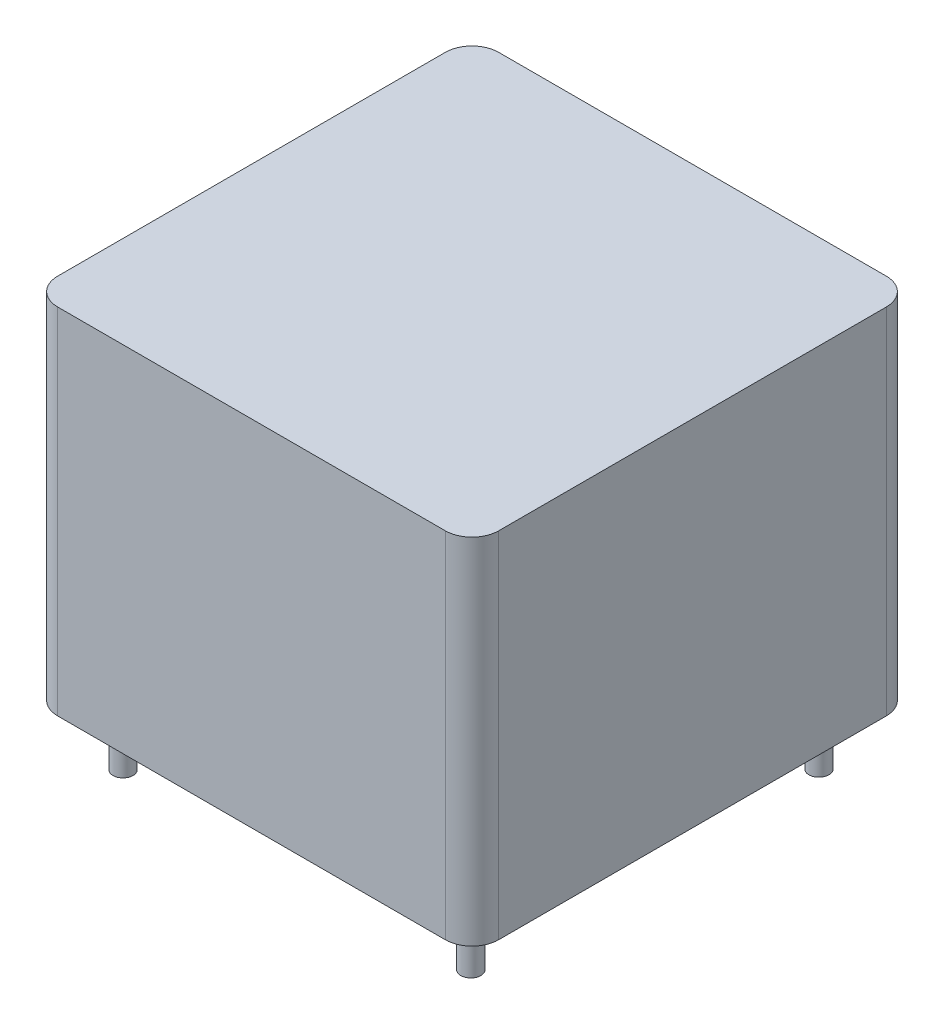
ISO-10303-21;
HEADER;
FILE_DESCRIPTION(('STEP AP214'),'2;1');
FILE_NAME('part.step','',(''),(''),'','','');
FILE_SCHEMA(('AUTOMOTIVE_DESIGN { 1 0 10303 214 1 1 1 1 }'));
ENDSEC;
DATA;
#1=APPLICATION_CONTEXT('core data for automotive mechanical design processes');
#2=APPLICATION_PROTOCOL_DEFINITION('international standard','automotive_design',2000,#1);
#3=PRODUCT_CONTEXT('',#1,'mechanical');
#4=PRODUCT('Part','Part','',(#3));
#5=PRODUCT_RELATED_PRODUCT_CATEGORY('part','',(#4));
#6=PRODUCT_DEFINITION_FORMATION('','',#4);
#7=PRODUCT_DEFINITION_CONTEXT('part definition',#1,'design');
#8=PRODUCT_DEFINITION('design','',#6,#7);
#9=PRODUCT_DEFINITION_SHAPE('','',#8);
#10=(LENGTH_UNIT() NAMED_UNIT(*) SI_UNIT(.MILLI.,.METRE.));
#11=(NAMED_UNIT(*) PLANE_ANGLE_UNIT() SI_UNIT($,.RADIAN.));
#12=(NAMED_UNIT(*) SI_UNIT($,.STERADIAN.) SOLID_ANGLE_UNIT());
#13=UNCERTAINTY_MEASURE_WITH_UNIT(LENGTH_MEASURE(1.E-05),#10,'distance_accuracy_value','');
#14=(GEOMETRIC_REPRESENTATION_CONTEXT(3) GLOBAL_UNCERTAINTY_ASSIGNED_CONTEXT((#13)) GLOBAL_UNIT_ASSIGNED_CONTEXT((#10,
#11,#12)) REPRESENTATION_CONTEXT('',''));
#15=CARTESIAN_POINT('',(0.,0.,0.));
#16=DIRECTION('',(0.,0.,1.));
#17=DIRECTION('',(1.,0.,0.));
#18=AXIS2_PLACEMENT_3D('',#15,#16,#17);
#19=CARTESIAN_POINT('',(0.,0.,0.));
#20=DIRECTION('',(0.,1.,0.));
#21=DIRECTION('',(0.,0.,1.));
#22=AXIS2_PLACEMENT_3D('',#19,#20,#21);
#23=PLANE('',#22);
#24=CARTESIAN_POINT('',(-15.4861925817402,0.,-28.7497144848234));
#25=DIRECTION('',(0.,1.,0.));
#26=DIRECTION('',(0.,0.,1.));
#27=AXIS2_PLACEMENT_3D('',#24,#25,#26);
#28=CIRCLE('',#27,1.5);
#29=CARTESIAN_POINT('',(-15.4861925817402,0.,-27.2497144848234));
#30=VERTEX_POINT('',#29);
#31=EDGE_CURVE('E12',#30,#30,#28,.F.);
#32=ORIENTED_EDGE('',*,*,#31,.F.);
#33=EDGE_LOOP('',(#32));
#34=FACE_BOUND('',#33,.T.);
#35=CARTESIAN_POINT('',(36.443385973789,0.,-28.7548469949988));
#36=DIRECTION('',(0.,1.,0.));
#37=DIRECTION('',(0.,0.,1.));
#38=AXIS2_PLACEMENT_3D('',#35,#36,#37);
#39=CIRCLE('',#38,1.5);
#40=CARTESIAN_POINT('',(36.443385973789,0.,-27.2548469949988));
#41=VERTEX_POINT('',#40);
#42=EDGE_CURVE('E73',#41,#41,#39,.F.);
#43=ORIENTED_EDGE('',*,*,#42,.F.);
#44=EDGE_LOOP('',(#43));
#45=FACE_BOUND('',#44,.T.);
#46=CARTESIAN_POINT('',(36.4185541223803,0.,23.3112749532062));
#47=DIRECTION('',(0.,1.,0.));
#48=DIRECTION('',(0.,0.,1.));
#49=AXIS2_PLACEMENT_3D('',#46,#47,#48);
#50=CIRCLE('',#49,1.5);
#51=CARTESIAN_POINT('',(36.4185541223803,0.,24.8112749532062));
#52=VERTEX_POINT('',#51);
#53=EDGE_CURVE('E319',#52,#52,#50,.F.);
#54=ORIENTED_EDGE('',*,*,#53,.F.);
#55=EDGE_LOOP('',(#54));
#56=FACE_BOUND('',#55,.T.);
#57=CARTESIAN_POINT('',(-15.5268571428572,0.,23.4071279985881));
#58=DIRECTION('',(0.,1.,0.));
#59=DIRECTION('',(0.,0.,1.));
#60=AXIS2_PLACEMENT_3D('',#57,#58,#59);
#61=CIRCLE('',#60,1.5);
#62=CARTESIAN_POINT('',(-15.5268571428572,0.,24.9071279985881));
#63=VERTEX_POINT('',#62);
#64=EDGE_CURVE('E316',#63,#63,#61,.F.);
#65=ORIENTED_EDGE('',*,*,#64,.F.);
#66=EDGE_LOOP('',(#65));
#67=FACE_BOUND('',#66,.T.);
#68=DIRECTION('',(0.,0.,-1.));
#69=VECTOR('',#68,1.);
#70=CARTESIAN_POINT('',(40.6071428571428,0.,-32.6785714285714));
#71=LINE('',#70,#69);
#72=CARTESIAN_POINT('',(40.6071428571428,0.,19.3214285714286));
#73=VERTEX_POINT('',#72);
#74=CARTESIAN_POINT('',(40.6071428571428,0.,-24.6785714285714));
#75=VERTEX_POINT('',#74);
#76=EDGE_CURVE('E339',#73,#75,#71,.T.);
#77=ORIENTED_EDGE('',*,*,#76,.T.);
#78=DIRECTION('',(-1.,0.,0.));
#79=VECTOR('',#78,1.);
#80=CARTESIAN_POINT('',(32.6071428571428,0.,-24.6785714285714));
#81=LINE('',#80,#79);
#82=CARTESIAN_POINT('',(32.6071428571428,0.,-24.6785714285714));
#83=VERTEX_POINT('',#82);
#84=EDGE_CURVE('E618',#75,#83,#81,.T.);
#85=ORIENTED_EDGE('',*,*,#84,.T.);
#86=DIRECTION('',(0.,0.,-1.));
#87=VECTOR('',#86,1.);
#88=CARTESIAN_POINT('',(32.6071428571428,0.,-32.6785714285714));
#89=LINE('',#88,#87);
#90=CARTESIAN_POINT('',(32.6071428571428,0.,-32.6785714285714));
#91=VERTEX_POINT('',#90);
#92=EDGE_CURVE('E250',#83,#91,#89,.T.);
#93=ORIENTED_EDGE('',*,*,#92,.T.);
#94=DIRECTION('',(-1.,0.,0.));
#95=VECTOR('',#94,1.);
#96=CARTESIAN_POINT('',(-19.3928571428572,0.,-32.6785714285713));
#97=LINE('',#96,#95);
#98=CARTESIAN_POINT('',(-11.3928571428572,0.,-32.6785714285714));
#99=VERTEX_POINT('',#98);
#100=EDGE_CURVE('E373',#91,#99,#97,.T.);
#101=ORIENTED_EDGE('',*,*,#100,.T.);
#102=DIRECTION('',(0.,0.,1.));
#103=VECTOR('',#102,1.);
#104=CARTESIAN_POINT('',(-11.3928571428572,0.,-24.6785714285714));
#105=LINE('',#104,#103);
#106=CARTESIAN_POINT('',(-11.3928571428572,0.,-24.6785714285714));
#107=VERTEX_POINT('',#106);
#108=EDGE_CURVE('E385',#99,#107,#105,.T.);
#109=ORIENTED_EDGE('',*,*,#108,.T.);
#110=DIRECTION('',(-1.,0.,0.));
#111=VECTOR('',#110,1.);
#112=CARTESIAN_POINT('',(-19.3928571428572,0.,-24.6785714285714));
#113=LINE('',#112,#111);
#114=CARTESIAN_POINT('',(-19.3928571428572,0.,-24.6785714285714));
#115=VERTEX_POINT('',#114);
#116=EDGE_CURVE('E395',#107,#115,#113,.T.);
#117=ORIENTED_EDGE('',*,*,#116,.T.);
#118=DIRECTION('',(0.,0.,1.));
#119=VECTOR('',#118,1.);
#120=CARTESIAN_POINT('',(-19.3928571428572,0.,-32.6785714285713));
#121=LINE('',#120,#119);
#122=CARTESIAN_POINT('',(-19.3928571428572,0.,19.3214285714286));
#123=VERTEX_POINT('',#122);
#124=EDGE_CURVE('E363',#115,#123,#121,.T.);
#125=ORIENTED_EDGE('',*,*,#124,.T.);
#126=DIRECTION('',(1.,0.,0.));
#127=VECTOR('',#126,1.);
#128=CARTESIAN_POINT('',(-11.3928571428572,0.,19.3214285714286));
#129=LINE('',#128,#127);
#130=CARTESIAN_POINT('',(-11.3928571428572,0.,19.3214285714286));
#131=VERTEX_POINT('',#130);
#132=EDGE_CURVE('E428',#123,#131,#129,.T.);
#133=ORIENTED_EDGE('',*,*,#132,.T.);
#134=DIRECTION('',(0.,0.,1.));
#135=VECTOR('',#134,1.);
#136=CARTESIAN_POINT('',(-11.3928571428572,0.,27.3214285714286));
#137=LINE('',#136,#135);
#138=CARTESIAN_POINT('',(-11.3928571428572,0.,27.3214285714286));
#139=VERTEX_POINT('',#138);
#140=EDGE_CURVE('E437',#131,#139,#137,.T.);
#141=ORIENTED_EDGE('',*,*,#140,.T.);
#142=DIRECTION('',(1.,0.,0.));
#143=VECTOR('',#142,1.);
#144=CARTESIAN_POINT('',(-19.3928571428572,0.,27.3214285714286));
#145=LINE('',#144,#143);
#146=CARTESIAN_POINT('',(32.6071428571428,0.,27.3214285714286));
#147=VERTEX_POINT('',#146);
#148=EDGE_CURVE('E379',#139,#147,#145,.T.);
#149=ORIENTED_EDGE('',*,*,#148,.T.);
#150=DIRECTION('',(0.,0.,-1.));
#151=VECTOR('',#150,1.);
#152=CARTESIAN_POINT('',(32.6071428571428,0.,27.3214285714286));
#153=LINE('',#152,#151);
#154=CARTESIAN_POINT('',(32.6071428571428,0.,19.3214285714286));
#155=VERTEX_POINT('',#154);
#156=EDGE_CURVE('E421',#147,#155,#153,.T.);
#157=ORIENTED_EDGE('',*,*,#156,.T.);
#158=DIRECTION('',(1.,0.,0.));
#159=VECTOR('',#158,1.);
#160=CARTESIAN_POINT('',(32.6071428571428,0.,19.3214285714286));
#161=LINE('',#160,#159);
#162=EDGE_CURVE('E412',#155,#73,#161,.T.);
#163=ORIENTED_EDGE('',*,*,#162,.T.);
#164=EDGE_LOOP('',(#77,#85,#93,#101,#109,#117,#125,#133,#141,#149,#157,#163));
#165=FACE_BOUND('',#164,.T.);
#166=DIRECTION('',(1.,0.,0.));
#167=VECTOR('',#166,1.);
#168=CARTESIAN_POINT('',(-19.3928571428572,0.,30.3214285714286));
#169=LINE('',#168,#167);
#170=CARTESIAN_POINT('',(-18.3928571428572,0.,30.3214285714286));
#171=VERTEX_POINT('',#170);
#172=CARTESIAN_POINT('',(39.6071428571428,0.,30.3214285714286));
#173=VERTEX_POINT('',#172);
#174=EDGE_CURVE('E271',#171,#173,#169,.T.);
#175=ORIENTED_EDGE('',*,*,#174,.F.);
#176=CARTESIAN_POINT('',(-18.3928571428572,0.,26.3214285714286));
#177=DIRECTION('',(0.,1.,0.));
#178=DIRECTION('',(0.,0.,1.));
#179=AXIS2_PLACEMENT_3D('',#176,#177,#178);
#180=CIRCLE('',#179,4.);
#181=CARTESIAN_POINT('',(-22.3928571428572,0.,26.3214285714286));
#182=VERTEX_POINT('',#181);
#183=EDGE_CURVE('E290',#171,#182,#180,.F.);
#184=ORIENTED_EDGE('',*,*,#183,.T.);
#185=DIRECTION('',(0.,0.,1.));
#186=VECTOR('',#185,1.);
#187=CARTESIAN_POINT('',(-22.3928571428572,0.,-32.6785714285713));
#188=LINE('',#187,#186);
#189=CARTESIAN_POINT('',(-22.3928571428572,0.,-31.6785714285713));
#190=VERTEX_POINT('',#189);
#191=EDGE_CURVE('E268',#190,#182,#188,.T.);
#192=ORIENTED_EDGE('',*,*,#191,.F.);
#193=CARTESIAN_POINT('',(-18.3928571428572,0.,-31.6785714285713));
#194=DIRECTION('',(0.,1.,0.));
#195=DIRECTION('',(0.,0.,1.));
#196=AXIS2_PLACEMENT_3D('',#193,#194,#195);
#197=CIRCLE('',#196,4.);
#198=CARTESIAN_POINT('',(-18.3928571428572,0.,-35.6785714285714));
#199=VERTEX_POINT('',#198);
#200=EDGE_CURVE('E284',#190,#199,#197,.F.);
#201=ORIENTED_EDGE('',*,*,#200,.T.);
#202=DIRECTION('',(-1.,0.,0.));
#203=VECTOR('',#202,1.);
#204=CARTESIAN_POINT('',(-19.3928571428572,0.,-35.6785714285714));
#205=LINE('',#204,#203);
#206=CARTESIAN_POINT('',(39.6071428571428,0.,-35.6785714285714));
#207=VERTEX_POINT('',#206);
#208=EDGE_CURVE('E277',#207,#199,#205,.T.);
#209=ORIENTED_EDGE('',*,*,#208,.F.);
#210=CARTESIAN_POINT('',(39.6071428571428,0.,-31.6785714285714));
#211=DIRECTION('',(0.,1.,0.));
#212=DIRECTION('',(0.,0.,1.));
#213=AXIS2_PLACEMENT_3D('',#210,#211,#212);
#214=CIRCLE('',#213,4.);
#215=CARTESIAN_POINT('',(43.6071428571428,0.,-31.6785714285714));
#216=VERTEX_POINT('',#215);
#217=EDGE_CURVE('E286',#207,#216,#214,.F.);
#218=ORIENTED_EDGE('',*,*,#217,.T.);
#219=DIRECTION('',(0.,0.,-1.));
#220=VECTOR('',#219,1.);
#221=CARTESIAN_POINT('',(43.6071428571428,0.,-32.6785714285714));
#222=LINE('',#221,#220);
#223=CARTESIAN_POINT('',(43.6071428571428,0.,26.3214285714286));
#224=VERTEX_POINT('',#223);
#225=EDGE_CURVE('E274',#224,#216,#222,.T.);
#226=ORIENTED_EDGE('',*,*,#225,.F.);
#227=CARTESIAN_POINT('',(39.6071428571428,0.,26.3214285714286));
#228=DIRECTION('',(0.,1.,0.));
#229=DIRECTION('',(0.,0.,1.));
#230=AXIS2_PLACEMENT_3D('',#227,#228,#229);
#231=CIRCLE('',#230,4.);
#232=EDGE_CURVE('E288',#224,#173,#231,.F.);
#233=ORIENTED_EDGE('',*,*,#232,.T.);
#234=EDGE_LOOP('',(#175,#184,#192,#201,#209,#218,#226,#233));
#235=FACE_BOUND('',#234,.T.);
#236=ADVANCED_FACE('F65',(#34,#45,#56,#67,#165,#235),#23,.F.);
#237=CARTESIAN_POINT('',(-22.3928571428572,50.,-32.6785714285713));
#238=DIRECTION('',(1.,0.,0.));
#239=DIRECTION('',(0.,0.,-1.));
#240=AXIS2_PLACEMENT_3D('',#237,#238,#239);
#241=PLANE('',#240);
#242=ORIENTED_EDGE('',*,*,#191,.T.);
#243=DIRECTION('',(0.,-1.,0.));
#244=VECTOR('',#243,1.);
#245=CARTESIAN_POINT('',(-22.3928571428572,50.,26.3214285714286));
#246=LINE('',#245,#244);
#247=CARTESIAN_POINT('',(-22.3928571428572,53.,26.3214285714286));
#248=VERTEX_POINT('',#247);
#249=EDGE_CURVE('E295',#182,#248,#246,.F.);
#250=ORIENTED_EDGE('',*,*,#249,.T.);
#251=DIRECTION('',(0.,0.,1.));
#252=VECTOR('',#251,1.);
#253=CARTESIAN_POINT('',(-22.3928571428572,53.,-35.6785714285714));
#254=LINE('',#253,#252);
#255=CARTESIAN_POINT('',(-22.3928571428572,53.,-31.6785714285713));
#256=VERTEX_POINT('',#255);
#257=EDGE_CURVE('E365',#256,#248,#254,.T.);
#258=ORIENTED_EDGE('',*,*,#257,.F.);
#259=DIRECTION('',(0.,-1.,0.));
#260=VECTOR('',#259,1.);
#261=CARTESIAN_POINT('',(-22.3928571428572,50.,-31.6785714285713));
#262=LINE('',#261,#260);
#263=EDGE_CURVE('E292',#256,#190,#262,.T.);
#264=ORIENTED_EDGE('',*,*,#263,.T.);
#265=EDGE_LOOP('',(#242,#250,#258,#264));
#266=FACE_BOUND('',#265,.T.);
#267=ADVANCED_FACE('F328',(#266),#241,.F.);
#268=CARTESIAN_POINT('',(-19.3928571428572,50.,30.3214285714286));
#269=DIRECTION('',(0.,0.,-1.));
#270=DIRECTION('',(-1.,0.,0.));
#271=AXIS2_PLACEMENT_3D('',#268,#269,#270);
#272=PLANE('',#271);
#273=DIRECTION('',(1.,0.,0.));
#274=VECTOR('',#273,1.);
#275=CARTESIAN_POINT('',(-22.3928571428572,53.,30.3214285714286));
#276=LINE('',#275,#274);
#277=CARTESIAN_POINT('',(-18.3928571428572,53.,30.3214285714286));
#278=VERTEX_POINT('',#277);
#279=CARTESIAN_POINT('',(39.6071428571428,53.,30.3214285714286));
#280=VERTEX_POINT('',#279);
#281=EDGE_CURVE('E357',#278,#280,#276,.T.);
#282=ORIENTED_EDGE('',*,*,#281,.F.);
#283=DIRECTION('',(0.,-1.,0.));
#284=VECTOR('',#283,1.);
#285=CARTESIAN_POINT('',(-18.3928571428572,50.,30.3214285714286));
#286=LINE('',#285,#284);
#287=EDGE_CURVE('E281',#278,#171,#286,.T.);
#288=ORIENTED_EDGE('',*,*,#287,.T.);
#289=ORIENTED_EDGE('',*,*,#174,.T.);
#290=DIRECTION('',(0.,-1.,0.));
#291=VECTOR('',#290,1.);
#292=CARTESIAN_POINT('',(39.6071428571428,50.,30.3214285714286));
#293=LINE('',#292,#291);
#294=EDGE_CURVE('E279',#173,#280,#293,.F.);
#295=ORIENTED_EDGE('',*,*,#294,.T.);
#296=EDGE_LOOP('',(#282,#288,#289,#295));
#297=FACE_BOUND('',#296,.T.);
#298=ADVANCED_FACE('F346',(#297),#272,.F.);
#299=CARTESIAN_POINT('',(43.6071428571428,50.,-32.6785714285714));
#300=DIRECTION('',(-1.,0.,0.));
#301=DIRECTION('',(0.,0.,1.));
#302=AXIS2_PLACEMENT_3D('',#299,#300,#301);
#303=PLANE('',#302);
#304=DIRECTION('',(0.,0.,-1.));
#305=VECTOR('',#304,1.);
#306=CARTESIAN_POINT('',(43.6071428571428,53.,-35.6785714285714));
#307=LINE('',#306,#305);
#308=CARTESIAN_POINT('',(43.6071428571428,53.,26.3214285714286));
#309=VERTEX_POINT('',#308);
#310=CARTESIAN_POINT('',(43.6071428571428,53.,-31.6785714285714));
#311=VERTEX_POINT('',#310);
#312=EDGE_CURVE('E356',#309,#311,#307,.T.);
#313=ORIENTED_EDGE('',*,*,#312,.F.);
#314=DIRECTION('',(0.,-1.,0.));
#315=VECTOR('',#314,1.);
#316=CARTESIAN_POINT('',(43.6071428571428,50.,26.3214285714286));
#317=LINE('',#316,#315);
#318=EDGE_CURVE('E306',#309,#224,#317,.T.);
#319=ORIENTED_EDGE('',*,*,#318,.T.);
#320=ORIENTED_EDGE('',*,*,#225,.T.);
#321=DIRECTION('',(0.,-1.,0.));
#322=VECTOR('',#321,1.);
#323=CARTESIAN_POINT('',(43.6071428571428,50.,-31.6785714285714));
#324=LINE('',#323,#322);
#325=EDGE_CURVE('E304',#216,#311,#324,.F.);
#326=ORIENTED_EDGE('',*,*,#325,.T.);
#327=EDGE_LOOP('',(#313,#319,#320,#326));
#328=FACE_BOUND('',#327,.T.);
#329=ADVANCED_FACE('F359',(#328),#303,.F.);
#330=CARTESIAN_POINT('',(-19.3928571428572,50.,-35.6785714285714));
#331=DIRECTION('',(0.,0.,1.));
#332=DIRECTION('',(1.,0.,0.));
#333=AXIS2_PLACEMENT_3D('',#330,#331,#332);
#334=PLANE('',#333);
#335=DIRECTION('',(-1.,0.,0.));
#336=VECTOR('',#335,1.);
#337=CARTESIAN_POINT('',(-22.3928571428572,53.,-35.6785714285714));
#338=LINE('',#337,#336);
#339=CARTESIAN_POINT('',(39.6071428571428,53.,-35.6785714285714));
#340=VERTEX_POINT('',#339);
#341=CARTESIAN_POINT('',(-18.3928571428572,53.,-35.6785714285714));
#342=VERTEX_POINT('',#341);
#343=EDGE_CURVE('E361',#340,#342,#338,.T.);
#344=ORIENTED_EDGE('',*,*,#343,.F.);
#345=DIRECTION('',(0.,-1.,0.));
#346=VECTOR('',#345,1.);
#347=CARTESIAN_POINT('',(39.6071428571428,50.,-35.6785714285714));
#348=LINE('',#347,#346);
#349=EDGE_CURVE('E310',#340,#207,#348,.T.);
#350=ORIENTED_EDGE('',*,*,#349,.T.);
#351=ORIENTED_EDGE('',*,*,#208,.T.);
#352=DIRECTION('',(0.,-1.,0.));
#353=VECTOR('',#352,1.);
#354=CARTESIAN_POINT('',(-18.3928571428572,50.,-35.6785714285714));
#355=LINE('',#354,#353);
#356=EDGE_CURVE('E80',#199,#342,#355,.F.);
#357=ORIENTED_EDGE('',*,*,#356,.T.);
#358=EDGE_LOOP('',(#344,#350,#351,#357));
#359=FACE_BOUND('',#358,.T.);
#360=ADVANCED_FACE('F466',(#359),#334,.F.);
#361=CARTESIAN_POINT('',(-19.3928571428572,50.,-32.6785714285713));
#362=DIRECTION('',(1.,0.,0.));
#363=DIRECTION('',(0.,0.,-1.));
#364=AXIS2_PLACEMENT_3D('',#361,#362,#363);
#365=PLANE('',#364);
#366=DIRECTION('',(0.,-1.,0.));
#367=VECTOR('',#366,1.);
#368=CARTESIAN_POINT('',(-19.3928571428572,3.,-24.6785714285714));
#369=LINE('',#368,#367);
#370=CARTESIAN_POINT('',(-19.3928571428572,3.,-24.6785714285714));
#371=VERTEX_POINT('',#370);
#372=EDGE_CURVE('E401',#371,#115,#369,.T.);
#373=ORIENTED_EDGE('',*,*,#372,.F.);
#374=DIRECTION('',(0.,0.,-1.));
#375=VECTOR('',#374,1.);
#376=CARTESIAN_POINT('',(-19.3928571428572,3.,-32.6785714285713));
#377=LINE('',#376,#375);
#378=CARTESIAN_POINT('',(-19.3928571428572,3.,-32.6785714285713));
#379=VERTEX_POINT('',#378);
#380=EDGE_CURVE('E630',#371,#379,#377,.T.);
#381=ORIENTED_EDGE('',*,*,#380,.T.);
#382=DIRECTION('',(0.,-1.,0.));
#383=VECTOR('',#382,1.);
#384=CARTESIAN_POINT('',(-19.3928571428572,50.,-32.6785714285713));
#385=LINE('',#384,#383);
#386=CARTESIAN_POINT('',(-19.3928571428572,50.,-32.6785714285713));
#387=VERTEX_POINT('',#386);
#388=EDGE_CURVE('E256',#387,#379,#385,.T.);
#389=ORIENTED_EDGE('',*,*,#388,.F.);
#390=DIRECTION('',(0.,0.,1.));
#391=VECTOR('',#390,1.);
#392=CARTESIAN_POINT('',(-19.3928571428572,50.,-32.6785714285713));
#393=LINE('',#392,#391);
#394=CARTESIAN_POINT('',(-19.3928571428572,50.,27.3214285714286));
#395=VERTEX_POINT('',#394);
#396=EDGE_CURVE('E369',#387,#395,#393,.T.);
#397=ORIENTED_EDGE('',*,*,#396,.T.);
#398=DIRECTION('',(0.,-1.,0.));
#399=VECTOR('',#398,1.);
#400=CARTESIAN_POINT('',(-19.3928571428572,50.,27.3214285714286));
#401=LINE('',#400,#399);
#402=CARTESIAN_POINT('',(-19.3928571428572,3.,27.3214285714286));
#403=VERTEX_POINT('',#402);
#404=EDGE_CURVE('E259',#395,#403,#401,.T.);
#405=ORIENTED_EDGE('',*,*,#404,.T.);
#406=DIRECTION('',(0.,0.,-1.));
#407=VECTOR('',#406,1.);
#408=CARTESIAN_POINT('',(-19.3928571428572,3.,19.3214285714286));
#409=LINE('',#408,#407);
#410=CARTESIAN_POINT('',(-19.3928571428572,3.,19.3214285714286));
#411=VERTEX_POINT('',#410);
#412=EDGE_CURVE('E436',#403,#411,#409,.T.);
#413=ORIENTED_EDGE('',*,*,#412,.T.);
#414=DIRECTION('',(0.,-1.,0.));
#415=VECTOR('',#414,1.);
#416=CARTESIAN_POINT('',(-19.3928571428572,3.,19.3214285714286));
#417=LINE('',#416,#415);
#418=EDGE_CURVE('E446',#411,#123,#417,.T.);
#419=ORIENTED_EDGE('',*,*,#418,.T.);
#420=ORIENTED_EDGE('',*,*,#124,.F.);
#421=EDGE_LOOP('',(#373,#381,#389,#397,#405,#413,#419,#420));
#422=FACE_BOUND('',#421,.T.);
#423=ADVANCED_FACE('F493',(#422),#365,.T.);
#424=CARTESIAN_POINT('',(-19.3928571428572,50.,27.3214285714286));
#425=DIRECTION('',(0.,0.,-1.));
#426=DIRECTION('',(-1.,0.,0.));
#427=AXIS2_PLACEMENT_3D('',#424,#425,#426);
#428=PLANE('',#427);
#429=DIRECTION('',(0.,-1.,0.));
#430=VECTOR('',#429,1.);
#431=CARTESIAN_POINT('',(32.6071428571428,3.,27.3214285714286));
#432=LINE('',#431,#430);
#433=CARTESIAN_POINT('',(32.6071428571428,3.,27.3214285714286));
#434=VERTEX_POINT('',#433);
#435=EDGE_CURVE('E420',#434,#147,#432,.T.);
#436=ORIENTED_EDGE('',*,*,#435,.T.);
#437=ORIENTED_EDGE('',*,*,#148,.F.);
#438=DIRECTION('',(0.,-1.,0.));
#439=VECTOR('',#438,1.);
#440=CARTESIAN_POINT('',(-11.3928571428572,3.,27.3214285714286));
#441=LINE('',#440,#439);
#442=CARTESIAN_POINT('',(-11.3928571428572,3.,27.3214285714286));
#443=VERTEX_POINT('',#442);
#444=EDGE_CURVE('E450',#443,#139,#441,.T.);
#445=ORIENTED_EDGE('',*,*,#444,.F.);
#446=DIRECTION('',(-1.,0.,0.));
#447=VECTOR('',#446,1.);
#448=CARTESIAN_POINT('',(-19.3928571428572,3.,27.3214285714286));
#449=LINE('',#448,#447);
#450=EDGE_CURVE('E433',#443,#403,#449,.T.);
#451=ORIENTED_EDGE('',*,*,#450,.T.);
#452=ORIENTED_EDGE('',*,*,#404,.F.);
#453=DIRECTION('',(1.,0.,0.));
#454=VECTOR('',#453,1.);
#455=CARTESIAN_POINT('',(-19.3928571428572,50.,27.3214285714286));
#456=LINE('',#455,#454);
#457=CARTESIAN_POINT('',(40.6071428571428,50.,27.3214285714286));
#458=VERTEX_POINT('',#457);
#459=EDGE_CURVE('E372',#395,#458,#456,.T.);
#460=ORIENTED_EDGE('',*,*,#459,.T.);
#461=DIRECTION('',(0.,-1.,0.));
#462=VECTOR('',#461,1.);
#463=CARTESIAN_POINT('',(40.6071428571428,50.,27.3214285714286));
#464=LINE('',#463,#462);
#465=CARTESIAN_POINT('',(40.6071428571428,3.,27.3214285714286));
#466=VERTEX_POINT('',#465);
#467=EDGE_CURVE('E255',#458,#466,#464,.T.);
#468=ORIENTED_EDGE('',*,*,#467,.T.);
#469=DIRECTION('',(-1.,0.,0.));
#470=VECTOR('',#469,1.);
#471=CARTESIAN_POINT('',(32.6071428571428,3.,27.3214285714286));
#472=LINE('',#471,#470);
#473=EDGE_CURVE('E408',#466,#434,#472,.T.);
#474=ORIENTED_EDGE('',*,*,#473,.T.);
#475=EDGE_LOOP('',(#436,#437,#445,#451,#452,#460,#468,#474));
#476=FACE_BOUND('',#475,.T.);
#477=ADVANCED_FACE('F497',(#476),#428,.T.);
#478=CARTESIAN_POINT('',(40.6071428571428,50.,-32.6785714285714));
#479=DIRECTION('',(-1.,0.,0.));
#480=DIRECTION('',(0.,0.,1.));
#481=AXIS2_PLACEMENT_3D('',#478,#479,#480);
#482=PLANE('',#481);
#483=DIRECTION('',(0.,-1.,0.));
#484=VECTOR('',#483,1.);
#485=CARTESIAN_POINT('',(40.6071428571428,3.,-24.6785714285714));
#486=LINE('',#485,#484);
#487=CARTESIAN_POINT('',(40.6071428571428,3.,-24.6785714285714));
#488=VERTEX_POINT('',#487);
#489=EDGE_CURVE('E623',#488,#75,#486,.T.);
#490=ORIENTED_EDGE('',*,*,#489,.T.);
#491=ORIENTED_EDGE('',*,*,#76,.F.);
#492=DIRECTION('',(0.,-1.,0.));
#493=VECTOR('',#492,1.);
#494=CARTESIAN_POINT('',(40.6071428571428,3.,19.3214285714286));
#495=LINE('',#494,#493);
#496=CARTESIAN_POINT('',(40.6071428571428,3.,19.3214285714286));
#497=VERTEX_POINT('',#496);
#498=EDGE_CURVE('E425',#497,#73,#495,.T.);
#499=ORIENTED_EDGE('',*,*,#498,.F.);
#500=DIRECTION('',(0.,0.,1.));
#501=VECTOR('',#500,1.);
#502=CARTESIAN_POINT('',(40.6071428571428,3.,27.3214285714286));
#503=LINE('',#502,#501);
#504=EDGE_CURVE('E417',#497,#466,#503,.T.);
#505=ORIENTED_EDGE('',*,*,#504,.T.);
#506=ORIENTED_EDGE('',*,*,#467,.F.);
#507=DIRECTION('',(0.,0.,-1.));
#508=VECTOR('',#507,1.);
#509=CARTESIAN_POINT('',(40.6071428571428,50.,-32.6785714285714));
#510=LINE('',#509,#508);
#511=CARTESIAN_POINT('',(40.6071428571428,50.,-32.6785714285714));
#512=VERTEX_POINT('',#511);
#513=EDGE_CURVE('E254',#458,#512,#510,.T.);
#514=ORIENTED_EDGE('',*,*,#513,.T.);
#515=DIRECTION('',(0.,-1.,0.));
#516=VECTOR('',#515,1.);
#517=CARTESIAN_POINT('',(40.6071428571428,50.,-32.6785714285714));
#518=LINE('',#517,#516);
#519=CARTESIAN_POINT('',(40.6071428571428,3.,-32.6785714285714));
#520=VERTEX_POINT('',#519);
#521=EDGE_CURVE('E245',#512,#520,#518,.T.);
#522=ORIENTED_EDGE('',*,*,#521,.T.);
#523=DIRECTION('',(0.,0.,1.));
#524=VECTOR('',#523,1.);
#525=CARTESIAN_POINT('',(40.6071428571428,3.,-24.6785714285714));
#526=LINE('',#525,#524);
#527=EDGE_CURVE('E228',#520,#488,#526,.T.);
#528=ORIENTED_EDGE('',*,*,#527,.T.);
#529=EDGE_LOOP('',(#490,#491,#499,#505,#506,#514,#522,#528));
#530=FACE_BOUND('',#529,.T.);
#531=ADVANCED_FACE('F252',(#530),#482,.T.);
#532=CARTESIAN_POINT('',(-19.3928571428572,50.,-32.6785714285713));
#533=DIRECTION('',(0.,0.,1.));
#534=DIRECTION('',(1.,0.,0.));
#535=AXIS2_PLACEMENT_3D('',#532,#533,#534);
#536=PLANE('',#535);
#537=DIRECTION('',(0.,-1.,0.));
#538=VECTOR('',#537,1.);
#539=CARTESIAN_POINT('',(32.6071428571428,3.,-32.6785714285714));
#540=LINE('',#539,#538);
#541=CARTESIAN_POINT('',(32.6071428571428,3.,-32.6785714285714));
#542=VERTEX_POINT('',#541);
#543=EDGE_CURVE('E249',#542,#91,#540,.T.);
#544=ORIENTED_EDGE('',*,*,#543,.F.);
#545=DIRECTION('',(1.,0.,0.));
#546=VECTOR('',#545,1.);
#547=CARTESIAN_POINT('',(40.6071428571428,3.,-32.6785714285714));
#548=LINE('',#547,#546);
#549=EDGE_CURVE('E232',#542,#520,#548,.T.);
#550=ORIENTED_EDGE('',*,*,#549,.T.);
#551=ORIENTED_EDGE('',*,*,#521,.F.);
#552=DIRECTION('',(-1.,0.,0.));
#553=VECTOR('',#552,1.);
#554=CARTESIAN_POINT('',(-19.3928571428572,50.,-32.6785714285713));
#555=LINE('',#554,#553);
#556=EDGE_CURVE('E262',#512,#387,#555,.T.);
#557=ORIENTED_EDGE('',*,*,#556,.T.);
#558=ORIENTED_EDGE('',*,*,#388,.T.);
#559=DIRECTION('',(1.,0.,0.));
#560=VECTOR('',#559,1.);
#561=CARTESIAN_POINT('',(-11.3928571428572,3.,-32.6785714285714));
#562=LINE('',#561,#560);
#563=CARTESIAN_POINT('',(-11.3928571428572,3.,-32.6785714285714));
#564=VERTEX_POINT('',#563);
#565=EDGE_CURVE('E398',#379,#564,#562,.T.);
#566=ORIENTED_EDGE('',*,*,#565,.T.);
#567=DIRECTION('',(0.,-1.,0.));
#568=VECTOR('',#567,1.);
#569=CARTESIAN_POINT('',(-11.3928571428572,3.,-32.6785714285714));
#570=LINE('',#569,#568);
#571=EDGE_CURVE('E392',#564,#99,#570,.T.);
#572=ORIENTED_EDGE('',*,*,#571,.T.);
#573=ORIENTED_EDGE('',*,*,#100,.F.);
#574=EDGE_LOOP('',(#544,#550,#551,#557,#558,#566,#572,#573));
#575=FACE_BOUND('',#574,.T.);
#576=ADVANCED_FACE('F243',(#575),#536,.T.);
#577=CARTESIAN_POINT('',(0.,50.,0.));
#578=DIRECTION('',(0.,1.,0.));
#579=DIRECTION('',(0.,0.,1.));
#580=AXIS2_PLACEMENT_3D('',#577,#578,#579);
#581=PLANE('',#580);
#582=CARTESIAN_POINT('',(-3.00585714285718,50.,2.68342857142865));
#583=DIRECTION('',(0.,1.,0.));
#584=DIRECTION('',(0.,0.,1.));
#585=AXIS2_PLACEMENT_3D('',#582,#583,#584);
#586=CIRCLE('',#585,6.5);
#587=CARTESIAN_POINT('',(-3.00585714285718,50.,9.18342857142864));
#588=VERTEX_POINT('',#587);
#589=EDGE_CURVE('E313',#588,#588,#586,.F.);
#590=ORIENTED_EDGE('',*,*,#589,.F.);
#591=EDGE_LOOP('',(#590));
#592=FACE_BOUND('',#591,.T.);
#593=ORIENTED_EDGE('',*,*,#459,.F.);
#594=ORIENTED_EDGE('',*,*,#396,.F.);
#595=ORIENTED_EDGE('',*,*,#556,.F.);
#596=ORIENTED_EDGE('',*,*,#513,.F.);
#597=EDGE_LOOP('',(#593,#594,#595,#596));
#598=FACE_BOUND('',#597,.T.);
#599=ADVANCED_FACE('F506',(#592,#598),#581,.F.);
#600=CARTESIAN_POINT('',(0.,53.,0.));
#601=DIRECTION('',(0.,1.,0.));
#602=DIRECTION('',(0.,0.,1.));
#603=AXIS2_PLACEMENT_3D('',#600,#601,#602);
#604=PLANE('',#603);
#605=ORIENTED_EDGE('',*,*,#257,.T.);
#606=CARTESIAN_POINT('',(-18.3928571428572,53.,26.3214285714286));
#607=DIRECTION('',(0.,1.,0.));
#608=DIRECTION('',(0.,0.,1.));
#609=AXIS2_PLACEMENT_3D('',#606,#607,#608);
#610=CIRCLE('',#609,4.);
#611=EDGE_CURVE('E302',#248,#278,#610,.T.);
#612=ORIENTED_EDGE('',*,*,#611,.T.);
#613=ORIENTED_EDGE('',*,*,#281,.T.);
#614=CARTESIAN_POINT('',(39.6071428571428,53.,26.3214285714286));
#615=DIRECTION('',(0.,1.,0.));
#616=DIRECTION('',(0.,0.,1.));
#617=AXIS2_PLACEMENT_3D('',#614,#615,#616);
#618=CIRCLE('',#617,4.);
#619=EDGE_CURVE('E300',#280,#309,#618,.T.);
#620=ORIENTED_EDGE('',*,*,#619,.T.);
#621=ORIENTED_EDGE('',*,*,#312,.T.);
#622=CARTESIAN_POINT('',(39.6071428571428,53.,-31.6785714285714));
#623=DIRECTION('',(0.,1.,0.));
#624=DIRECTION('',(0.,0.,1.));
#625=AXIS2_PLACEMENT_3D('',#622,#623,#624);
#626=CIRCLE('',#625,4.);
#627=EDGE_CURVE('E87',#311,#340,#626,.T.);
#628=ORIENTED_EDGE('',*,*,#627,.T.);
#629=ORIENTED_EDGE('',*,*,#343,.T.);
#630=CARTESIAN_POINT('',(-18.3928571428572,53.,-31.6785714285713));
#631=DIRECTION('',(0.,1.,0.));
#632=DIRECTION('',(0.,0.,1.));
#633=AXIS2_PLACEMENT_3D('',#630,#631,#632);
#634=CIRCLE('',#633,4.);
#635=EDGE_CURVE('E297',#342,#256,#634,.T.);
#636=ORIENTED_EDGE('',*,*,#635,.T.);
#637=EDGE_LOOP('',(#605,#612,#613,#620,#621,#628,#629,#636));
#638=FACE_BOUND('',#637,.T.);
#639=ADVANCED_FACE('F355',(#638),#604,.T.);
#640=CARTESIAN_POINT('',(-11.3928571428572,3.,27.3214285714286));
#641=DIRECTION('',(1.,0.,0.));
#642=DIRECTION('',(0.,0.,-1.));
#643=AXIS2_PLACEMENT_3D('',#640,#641,#642);
#644=PLANE('',#643);
#645=ORIENTED_EDGE('',*,*,#140,.F.);
#646=DIRECTION('',(0.,-1.,0.));
#647=VECTOR('',#646,1.);
#648=CARTESIAN_POINT('',(-11.3928571428572,3.,19.3214285714286));
#649=LINE('',#648,#647);
#650=CARTESIAN_POINT('',(-11.3928571428572,3.,19.3214285714286));
#651=VERTEX_POINT('',#650);
#652=EDGE_CURVE('E453',#651,#131,#649,.T.);
#653=ORIENTED_EDGE('',*,*,#652,.F.);
#654=DIRECTION('',(0.,0.,1.));
#655=VECTOR('',#654,1.);
#656=CARTESIAN_POINT('',(-11.3928571428572,3.,27.3214285714286));
#657=LINE('',#656,#655);
#658=EDGE_CURVE('E443',#651,#443,#657,.T.);
#659=ORIENTED_EDGE('',*,*,#658,.T.);
#660=ORIENTED_EDGE('',*,*,#444,.T.);
#661=EDGE_LOOP('',(#645,#653,#659,#660));
#662=FACE_BOUND('',#661,.T.);
#663=ADVANCED_FACE('F513',(#662),#644,.T.);
#664=CARTESIAN_POINT('',(-11.3928571428572,3.,19.3214285714286));
#665=DIRECTION('',(0.,0.,-1.));
#666=DIRECTION('',(-1.,0.,0.));
#667=AXIS2_PLACEMENT_3D('',#664,#665,#666);
#668=PLANE('',#667);
#669=ORIENTED_EDGE('',*,*,#132,.F.);
#670=ORIENTED_EDGE('',*,*,#418,.F.);
#671=DIRECTION('',(1.,0.,0.));
#672=VECTOR('',#671,1.);
#673=CARTESIAN_POINT('',(-11.3928571428572,3.,19.3214285714286));
#674=LINE('',#673,#672);
#675=EDGE_CURVE('E440',#411,#651,#674,.T.);
#676=ORIENTED_EDGE('',*,*,#675,.T.);
#677=ORIENTED_EDGE('',*,*,#652,.T.);
#678=EDGE_LOOP('',(#669,#670,#676,#677));
#679=FACE_BOUND('',#678,.T.);
#680=ADVANCED_FACE('F514',(#679),#668,.T.);
#681=CARTESIAN_POINT('',(0.,3.,0.));
#682=DIRECTION('',(0.,1.,0.));
#683=DIRECTION('',(0.,0.,1.));
#684=AXIS2_PLACEMENT_3D('',#681,#682,#683);
#685=PLANE('',#684);
#686=ORIENTED_EDGE('',*,*,#450,.F.);
#687=ORIENTED_EDGE('',*,*,#658,.F.);
#688=ORIENTED_EDGE('',*,*,#675,.F.);
#689=ORIENTED_EDGE('',*,*,#412,.F.);
#690=EDGE_LOOP('',(#686,#687,#688,#689));
#691=FACE_BOUND('',#690,.T.);
#692=ADVANCED_FACE('F517',(#691),#685,.T.);
#693=CARTESIAN_POINT('',(32.6071428571428,3.,19.3214285714286));
#694=DIRECTION('',(0.,0.,-1.));
#695=DIRECTION('',(-1.,0.,0.));
#696=AXIS2_PLACEMENT_3D('',#693,#694,#695);
#697=PLANE('',#696);
#698=ORIENTED_EDGE('',*,*,#162,.F.);
#699=DIRECTION('',(0.,-1.,0.));
#700=VECTOR('',#699,1.);
#701=CARTESIAN_POINT('',(32.6071428571428,3.,19.3214285714286));
#702=LINE('',#701,#700);
#703=CARTESIAN_POINT('',(32.6071428571428,3.,19.3214285714286));
#704=VERTEX_POINT('',#703);
#705=EDGE_CURVE('E429',#704,#155,#702,.T.);
#706=ORIENTED_EDGE('',*,*,#705,.F.);
#707=DIRECTION('',(1.,0.,0.));
#708=VECTOR('',#707,1.);
#709=CARTESIAN_POINT('',(32.6071428571428,3.,19.3214285714286));
#710=LINE('',#709,#708);
#711=EDGE_CURVE('E415',#704,#497,#710,.T.);
#712=ORIENTED_EDGE('',*,*,#711,.T.);
#713=ORIENTED_EDGE('',*,*,#498,.T.);
#714=EDGE_LOOP('',(#698,#706,#712,#713));
#715=FACE_BOUND('',#714,.T.);
#716=ADVANCED_FACE('F524',(#715),#697,.T.);
#717=CARTESIAN_POINT('',(32.6071428571428,3.,27.3214285714286));
#718=DIRECTION('',(-1.,0.,0.));
#719=DIRECTION('',(0.,0.,1.));
#720=AXIS2_PLACEMENT_3D('',#717,#718,#719);
#721=PLANE('',#720);
#722=ORIENTED_EDGE('',*,*,#156,.F.);
#723=ORIENTED_EDGE('',*,*,#435,.F.);
#724=DIRECTION('',(0.,0.,-1.));
#725=VECTOR('',#724,1.);
#726=CARTESIAN_POINT('',(32.6071428571428,3.,27.3214285714286));
#727=LINE('',#726,#725);
#728=EDGE_CURVE('E411',#434,#704,#727,.T.);
#729=ORIENTED_EDGE('',*,*,#728,.T.);
#730=ORIENTED_EDGE('',*,*,#705,.T.);
#731=EDGE_LOOP('',(#722,#723,#729,#730));
#732=FACE_BOUND('',#731,.T.);
#733=ADVANCED_FACE('F526',(#732),#721,.T.);
#734=CARTESIAN_POINT('',(0.,3.,0.));
#735=DIRECTION('',(0.,1.,0.));
#736=DIRECTION('',(0.,0.,1.));
#737=AXIS2_PLACEMENT_3D('',#734,#735,#736);
#738=PLANE('',#737);
#739=ORIENTED_EDGE('',*,*,#473,.F.);
#740=ORIENTED_EDGE('',*,*,#504,.F.);
#741=ORIENTED_EDGE('',*,*,#711,.F.);
#742=ORIENTED_EDGE('',*,*,#728,.F.);
#743=EDGE_LOOP('',(#739,#740,#741,#742));
#744=FACE_BOUND('',#743,.T.);
#745=ADVANCED_FACE('F529',(#744),#738,.T.);
#746=CARTESIAN_POINT('',(-19.3928571428572,3.,-24.6785714285714));
#747=DIRECTION('',(0.,0.,1.));
#748=DIRECTION('',(1.,0.,0.));
#749=AXIS2_PLACEMENT_3D('',#746,#747,#748);
#750=PLANE('',#749);
#751=ORIENTED_EDGE('',*,*,#116,.F.);
#752=DIRECTION('',(0.,-1.,0.));
#753=VECTOR('',#752,1.);
#754=CARTESIAN_POINT('',(-11.3928571428572,3.,-24.6785714285714));
#755=LINE('',#754,#753);
#756=CARTESIAN_POINT('',(-11.3928571428572,3.,-24.6785714285714));
#757=VERTEX_POINT('',#756);
#758=EDGE_CURVE('E394',#757,#107,#755,.T.);
#759=ORIENTED_EDGE('',*,*,#758,.F.);
#760=DIRECTION('',(-1.,0.,0.));
#761=VECTOR('',#760,1.);
#762=CARTESIAN_POINT('',(-19.3928571428572,3.,-24.6785714285714));
#763=LINE('',#762,#761);
#764=EDGE_CURVE('E399',#757,#371,#763,.T.);
#765=ORIENTED_EDGE('',*,*,#764,.T.);
#766=ORIENTED_EDGE('',*,*,#372,.T.);
#767=EDGE_LOOP('',(#751,#759,#765,#766));
#768=FACE_BOUND('',#767,.T.);
#769=ADVANCED_FACE('F536',(#768),#750,.T.);
#770=CARTESIAN_POINT('',(-11.3928571428572,3.,-24.6785714285714));
#771=DIRECTION('',(1.,0.,0.));
#772=DIRECTION('',(0.,0.,-1.));
#773=AXIS2_PLACEMENT_3D('',#770,#771,#772);
#774=PLANE('',#773);
#775=ORIENTED_EDGE('',*,*,#108,.F.);
#776=ORIENTED_EDGE('',*,*,#571,.F.);
#777=DIRECTION('',(0.,0.,1.));
#778=VECTOR('',#777,1.);
#779=CARTESIAN_POINT('',(-11.3928571428572,3.,-24.6785714285714));
#780=LINE('',#779,#778);
#781=EDGE_CURVE('E404',#564,#757,#780,.T.);
#782=ORIENTED_EDGE('',*,*,#781,.T.);
#783=ORIENTED_EDGE('',*,*,#758,.T.);
#784=EDGE_LOOP('',(#775,#776,#782,#783));
#785=FACE_BOUND('',#784,.T.);
#786=ADVANCED_FACE('F390',(#785),#774,.T.);
#787=CARTESIAN_POINT('',(0.,3.,0.));
#788=DIRECTION('',(0.,1.,0.));
#789=DIRECTION('',(0.,0.,1.));
#790=AXIS2_PLACEMENT_3D('',#787,#788,#789);
#791=PLANE('',#790);
#792=ORIENTED_EDGE('',*,*,#380,.F.);
#793=ORIENTED_EDGE('',*,*,#764,.F.);
#794=ORIENTED_EDGE('',*,*,#781,.F.);
#795=ORIENTED_EDGE('',*,*,#565,.F.);
#796=EDGE_LOOP('',(#792,#793,#794,#795));
#797=FACE_BOUND('',#796,.T.);
#798=ADVANCED_FACE('F540',(#797),#791,.T.);
#799=CARTESIAN_POINT('',(32.6071428571428,3.,-32.6785714285714));
#800=DIRECTION('',(-1.,0.,0.));
#801=DIRECTION('',(0.,0.,1.));
#802=AXIS2_PLACEMENT_3D('',#799,#800,#801);
#803=PLANE('',#802);
#804=ORIENTED_EDGE('',*,*,#92,.F.);
#805=DIRECTION('',(0.,-1.,0.));
#806=VECTOR('',#805,1.);
#807=CARTESIAN_POINT('',(32.6071428571428,3.,-24.6785714285714));
#808=LINE('',#807,#806);
#809=CARTESIAN_POINT('',(32.6071428571428,3.,-24.6785714285714));
#810=VERTEX_POINT('',#809);
#811=EDGE_CURVE('E627',#810,#83,#808,.T.);
#812=ORIENTED_EDGE('',*,*,#811,.F.);
#813=DIRECTION('',(0.,0.,-1.));
#814=VECTOR('',#813,1.);
#815=CARTESIAN_POINT('',(32.6071428571428,3.,-32.6785714285714));
#816=LINE('',#815,#814);
#817=EDGE_CURVE('E621',#810,#542,#816,.T.);
#818=ORIENTED_EDGE('',*,*,#817,.T.);
#819=ORIENTED_EDGE('',*,*,#543,.T.);
#820=EDGE_LOOP('',(#804,#812,#818,#819));
#821=FACE_BOUND('',#820,.T.);
#822=ADVANCED_FACE('F546',(#821),#803,.T.);
#823=CARTESIAN_POINT('',(32.6071428571428,3.,-24.6785714285714));
#824=DIRECTION('',(0.,0.,1.));
#825=DIRECTION('',(1.,0.,0.));
#826=AXIS2_PLACEMENT_3D('',#823,#824,#825);
#827=PLANE('',#826);
#828=ORIENTED_EDGE('',*,*,#84,.F.);
#829=ORIENTED_EDGE('',*,*,#489,.F.);
#830=DIRECTION('',(-1.,0.,0.));
#831=VECTOR('',#830,1.);
#832=CARTESIAN_POINT('',(32.6071428571428,3.,-24.6785714285714));
#833=LINE('',#832,#831);
#834=EDGE_CURVE('E235',#488,#810,#833,.T.);
#835=ORIENTED_EDGE('',*,*,#834,.T.);
#836=ORIENTED_EDGE('',*,*,#811,.T.);
#837=EDGE_LOOP('',(#828,#829,#835,#836));
#838=FACE_BOUND('',#837,.T.);
#839=ADVANCED_FACE('F548',(#838),#827,.T.);
#840=CARTESIAN_POINT('',(0.,3.,0.));
#841=DIRECTION('',(0.,1.,0.));
#842=DIRECTION('',(0.,0.,1.));
#843=AXIS2_PLACEMENT_3D('',#840,#841,#842);
#844=PLANE('',#843);
#845=ORIENTED_EDGE('',*,*,#549,.F.);
#846=ORIENTED_EDGE('',*,*,#817,.F.);
#847=ORIENTED_EDGE('',*,*,#834,.F.);
#848=ORIENTED_EDGE('',*,*,#527,.F.);
#849=EDGE_LOOP('',(#845,#846,#847,#848));
#850=FACE_BOUND('',#849,.T.);
#851=ADVANCED_FACE('F230',(#850),#844,.T.);
#852=CARTESIAN_POINT('',(-18.3928571428572,50.,26.3214285714286));
#853=DIRECTION('',(0.,-1.,0.));
#854=DIRECTION('',(0.,0.,-1.));
#855=AXIS2_PLACEMENT_3D('',#852,#853,#854);
#856=CYLINDRICAL_SURFACE('',#855,4.);
#857=ORIENTED_EDGE('',*,*,#611,.F.);
#858=ORIENTED_EDGE('',*,*,#249,.F.);
#859=ORIENTED_EDGE('',*,*,#183,.F.);
#860=ORIENTED_EDGE('',*,*,#287,.F.);
#861=EDGE_LOOP('',(#857,#858,#859,#860));
#862=FACE_BOUND('',#861,.T.);
#863=ADVANCED_FACE('F463',(#862),#856,.T.);
#864=CARTESIAN_POINT('',(39.6071428571428,50.,26.3214285714286));
#865=DIRECTION('',(0.,-1.,0.));
#866=DIRECTION('',(0.,0.,-1.));
#867=AXIS2_PLACEMENT_3D('',#864,#865,#866);
#868=CYLINDRICAL_SURFACE('',#867,4.);
#869=ORIENTED_EDGE('',*,*,#619,.F.);
#870=ORIENTED_EDGE('',*,*,#294,.F.);
#871=ORIENTED_EDGE('',*,*,#232,.F.);
#872=ORIENTED_EDGE('',*,*,#318,.F.);
#873=EDGE_LOOP('',(#869,#870,#871,#872));
#874=FACE_BOUND('',#873,.T.);
#875=ADVANCED_FACE('F351',(#874),#868,.T.);
#876=CARTESIAN_POINT('',(39.6071428571428,50.,-31.6785714285714));
#877=DIRECTION('',(0.,-1.,0.));
#878=DIRECTION('',(0.,0.,-1.));
#879=AXIS2_PLACEMENT_3D('',#876,#877,#878);
#880=CYLINDRICAL_SURFACE('',#879,4.);
#881=ORIENTED_EDGE('',*,*,#627,.F.);
#882=ORIENTED_EDGE('',*,*,#325,.F.);
#883=ORIENTED_EDGE('',*,*,#217,.F.);
#884=ORIENTED_EDGE('',*,*,#349,.F.);
#885=EDGE_LOOP('',(#881,#882,#883,#884));
#886=FACE_BOUND('',#885,.T.);
#887=ADVANCED_FACE('F470',(#886),#880,.T.);
#888=CARTESIAN_POINT('',(-18.3928571428572,50.,-31.6785714285713));
#889=DIRECTION('',(0.,-1.,0.));
#890=DIRECTION('',(0.,0.,-1.));
#891=AXIS2_PLACEMENT_3D('',#888,#889,#890);
#892=CYLINDRICAL_SURFACE('',#891,4.);
#893=ORIENTED_EDGE('',*,*,#635,.F.);
#894=ORIENTED_EDGE('',*,*,#356,.F.);
#895=ORIENTED_EDGE('',*,*,#200,.F.);
#896=ORIENTED_EDGE('',*,*,#263,.F.);
#897=EDGE_LOOP('',(#893,#894,#895,#896));
#898=FACE_BOUND('',#897,.T.);
#899=ADVANCED_FACE('F67',(#898),#892,.T.);
#900=CARTESIAN_POINT('',(-3.00585714285718,45.,2.68342857142865));
#901=DIRECTION('',(0.,-1.,0.));
#902=DIRECTION('',(0.,0.,-1.));
#903=AXIS2_PLACEMENT_3D('',#900,#901,#902);
#904=PLANE('',#903);
#905=CARTESIAN_POINT('',(-3.00585714285718,45.,2.68342857142865));
#906=DIRECTION('',(0.,-1.,0.));
#907=DIRECTION('',(1.,0.,0.));
#908=AXIS2_PLACEMENT_3D('',#905,#906,#907);
#909=CIRCLE('',#908,6.5);
#910=CARTESIAN_POINT('',(3.49414285714282,45.,2.68342857142865));
#911=VERTEX_POINT('',#910);
#912=EDGE_CURVE('E614',#911,#911,#909,.T.);
#913=ORIENTED_EDGE('',*,*,#912,.T.);
#914=EDGE_LOOP('',(#913));
#915=FACE_BOUND('',#914,.T.);
#916=CARTESIAN_POINT('',(-3.00585714285718,45.,2.68342857142865));
#917=DIRECTION('',(0.,-1.,0.));
#918=DIRECTION('',(0.,0.,-1.));
#919=AXIS2_PLACEMENT_3D('',#916,#917,#918);
#920=CIRCLE('',#919,5.5);
#921=CARTESIAN_POINT('',(-3.00585714285718,45.,-2.81657142857135));
#922=VERTEX_POINT('',#921);
#923=EDGE_CURVE('E611',#922,#922,#920,.T.);
#924=ORIENTED_EDGE('',*,*,#923,.F.);
#925=EDGE_LOOP('',(#924));
#926=FACE_BOUND('',#925,.T.);
#927=ADVANCED_FACE('F469',(#915,#926),#904,.T.);
#928=CARTESIAN_POINT('',(-3.00585714285718,45.,2.68342857142865));
#929=DIRECTION('',(0.,1.,0.));
#930=DIRECTION('',(0.,0.,1.));
#931=AXIS2_PLACEMENT_3D('',#928,#929,#930);
#932=CYLINDRICAL_SURFACE('',#931,6.5);
#933=ORIENTED_EDGE('',*,*,#912,.F.);
#934=EDGE_LOOP('',(#933));
#935=FACE_BOUND('',#934,.T.);
#936=ORIENTED_EDGE('',*,*,#589,.T.);
#937=EDGE_LOOP('',(#936));
#938=FACE_BOUND('',#937,.T.);
#939=ADVANCED_FACE('F475',(#935,#938),#932,.T.);
#940=CARTESIAN_POINT('',(-3.00585714285718,45.,2.68342857142865));
#941=DIRECTION('',(0.,1.,0.));
#942=DIRECTION('',(0.,0.,1.));
#943=AXIS2_PLACEMENT_3D('',#940,#941,#942);
#944=CYLINDRICAL_SURFACE('',#943,5.5);
#945=ORIENTED_EDGE('',*,*,#923,.T.);
#946=EDGE_LOOP('',(#945));
#947=FACE_BOUND('',#946,.T.);
#948=CARTESIAN_POINT('',(-3.00585714285718,50.,2.68342857142865));
#949=DIRECTION('',(0.,-1.,0.));
#950=DIRECTION('',(0.,0.,-1.));
#951=AXIS2_PLACEMENT_3D('',#948,#949,#950);
#952=CIRCLE('',#951,5.5);
#953=CARTESIAN_POINT('',(-3.00585714285718,50.,-2.81657142857135));
#954=VERTEX_POINT('',#953);
#955=EDGE_CURVE('E610',#954,#954,#952,.T.);
#956=ORIENTED_EDGE('',*,*,#955,.F.);
#957=EDGE_LOOP('',(#956));
#958=FACE_BOUND('',#957,.T.);
#959=ADVANCED_FACE('F558',(#947,#958),#944,.F.);
#960=ORIENTED_EDGE('',*,*,#955,.T.);
#961=EDGE_LOOP('',(#960));
#962=FACE_BOUND('',#961,.T.);
#963=ADVANCED_FACE('F510',(#962),#581,.F.);
#964=CARTESIAN_POINT('',(-15.5268571428572,-9.,23.4071279985881));
#965=DIRECTION('',(0.,1.,0.));
#966=DIRECTION('',(0.,0.,1.));
#967=AXIS2_PLACEMENT_3D('',#964,#965,#966);
#968=CYLINDRICAL_SURFACE('',#967,1.5);
#969=CARTESIAN_POINT('',(-15.5268571428572,-9.,23.4071279985881));
#970=DIRECTION('',(0.,-1.,0.));
#971=DIRECTION('',(0.,0.,-1.));
#972=AXIS2_PLACEMENT_3D('',#969,#970,#971);
#973=CIRCLE('',#972,1.5);
#974=CARTESIAN_POINT('',(-15.5268571428572,-9.,21.9071279985881));
#975=VERTEX_POINT('',#974);
#976=EDGE_CURVE('E607',#975,#975,#973,.T.);
#977=ORIENTED_EDGE('',*,*,#976,.F.);
#978=EDGE_LOOP('',(#977));
#979=FACE_BOUND('',#978,.T.);
#980=ORIENTED_EDGE('',*,*,#64,.T.);
#981=EDGE_LOOP('',(#980));
#982=FACE_BOUND('',#981,.T.);
#983=ADVANCED_FACE('F564',(#979,#982),#968,.T.);
#984=CARTESIAN_POINT('',(-15.5268571428572,-9.,23.4071279985881));
#985=DIRECTION('',(0.,-1.,0.));
#986=DIRECTION('',(0.,0.,-1.));
#987=AXIS2_PLACEMENT_3D('',#984,#985,#986);
#988=PLANE('',#987);
#989=ORIENTED_EDGE('',*,*,#976,.T.);
#990=EDGE_LOOP('',(#989));
#991=FACE_BOUND('',#990,.T.);
#992=ADVANCED_FACE('F567',(#991),#988,.T.);
#993=CARTESIAN_POINT('',(36.4185541223803,-9.,23.3112749532062));
#994=DIRECTION('',(0.,1.,0.));
#995=DIRECTION('',(0.,0.,1.));
#996=AXIS2_PLACEMENT_3D('',#993,#994,#995);
#997=CYLINDRICAL_SURFACE('',#996,1.5);
#998=CARTESIAN_POINT('',(36.4185541223803,-9.,23.3112749532062));
#999=DIRECTION('',(0.,-1.,0.));
#1000=DIRECTION('',(0.,0.,-1.));
#1001=AXIS2_PLACEMENT_3D('',#998,#999,#1000);
#1002=CIRCLE('',#1001,1.5);
#1003=CARTESIAN_POINT('',(36.4185541223803,-9.,21.8112749532062));
#1004=VERTEX_POINT('',#1003);
#1005=EDGE_CURVE('E602',#1004,#1004,#1002,.T.);
#1006=ORIENTED_EDGE('',*,*,#1005,.F.);
#1007=EDGE_LOOP('',(#1006));
#1008=FACE_BOUND('',#1007,.T.);
#1009=ORIENTED_EDGE('',*,*,#53,.T.);
#1010=EDGE_LOOP('',(#1009));
#1011=FACE_BOUND('',#1010,.T.);
#1012=ADVANCED_FACE('F571',(#1008,#1011),#997,.T.);
#1013=CARTESIAN_POINT('',(36.4185541223803,-9.,23.3112749532062));
#1014=DIRECTION('',(0.,-1.,0.));
#1015=DIRECTION('',(0.,0.,-1.));
#1016=AXIS2_PLACEMENT_3D('',#1013,#1014,#1015);
#1017=PLANE('',#1016);
#1018=ORIENTED_EDGE('',*,*,#1005,.T.);
#1019=EDGE_LOOP('',(#1018));
#1020=FACE_BOUND('',#1019,.T.);
#1021=ADVANCED_FACE('F575',(#1020),#1017,.T.);
#1022=CARTESIAN_POINT('',(36.443385973789,-9.,-28.7548469949988));
#1023=DIRECTION('',(0.,1.,0.));
#1024=DIRECTION('',(0.,0.,1.));
#1025=AXIS2_PLACEMENT_3D('',#1022,#1023,#1024);
#1026=CYLINDRICAL_SURFACE('',#1025,1.5);
#1027=CARTESIAN_POINT('',(36.443385973789,-9.,-28.7548469949988));
#1028=DIRECTION('',(0.,-1.,0.));
#1029=DIRECTION('',(0.,0.,-1.));
#1030=AXIS2_PLACEMENT_3D('',#1027,#1028,#1029);
#1031=CIRCLE('',#1030,1.5);
#1032=CARTESIAN_POINT('',(36.443385973789,-9.,-30.2548469949988));
#1033=VERTEX_POINT('',#1032);
#1034=EDGE_CURVE('E599',#1033,#1033,#1031,.T.);
#1035=ORIENTED_EDGE('',*,*,#1034,.F.);
#1036=EDGE_LOOP('',(#1035));
#1037=FACE_BOUND('',#1036,.T.);
#1038=ORIENTED_EDGE('',*,*,#42,.T.);
#1039=EDGE_LOOP('',(#1038));
#1040=FACE_BOUND('',#1039,.T.);
#1041=ADVANCED_FACE('F324',(#1037,#1040),#1026,.T.);
#1042=CARTESIAN_POINT('',(36.443385973789,-9.,-28.7548469949988));
#1043=DIRECTION('',(0.,-1.,0.));
#1044=DIRECTION('',(0.,0.,-1.));
#1045=AXIS2_PLACEMENT_3D('',#1042,#1043,#1044);
#1046=PLANE('',#1045);
#1047=ORIENTED_EDGE('',*,*,#1034,.T.);
#1048=EDGE_LOOP('',(#1047));
#1049=FACE_BOUND('',#1048,.T.);
#1050=ADVANCED_FACE('F582',(#1049),#1046,.T.);
#1051=CARTESIAN_POINT('',(-15.4861925817402,-9.,-28.7497144848234));
#1052=DIRECTION('',(0.,1.,0.));
#1053=DIRECTION('',(0.,0.,1.));
#1054=AXIS2_PLACEMENT_3D('',#1051,#1052,#1053);
#1055=CYLINDRICAL_SURFACE('',#1054,1.5);
#1056=CARTESIAN_POINT('',(-15.4861925817402,-9.,-28.7497144848234));
#1057=DIRECTION('',(0.,-1.,0.));
#1058=DIRECTION('',(0.,0.,-1.));
#1059=AXIS2_PLACEMENT_3D('',#1056,#1057,#1058);
#1060=CIRCLE('',#1059,1.5);
#1061=CARTESIAN_POINT('',(-15.4861925817402,-9.,-30.2497144848234));
#1062=VERTEX_POINT('',#1061);
#1063=EDGE_CURVE('E598',#1062,#1062,#1060,.T.);
#1064=ORIENTED_EDGE('',*,*,#1063,.F.);
#1065=EDGE_LOOP('',(#1064));
#1066=FACE_BOUND('',#1065,.T.);
#1067=ORIENTED_EDGE('',*,*,#31,.T.);
#1068=EDGE_LOOP('',(#1067));
#1069=FACE_BOUND('',#1068,.T.);
#1070=ADVANCED_FACE('F586',(#1066,#1069),#1055,.T.);
#1071=CARTESIAN_POINT('',(-15.4861925817402,-9.,-28.7497144848234));
#1072=DIRECTION('',(0.,-1.,0.));
#1073=DIRECTION('',(0.,0.,-1.));
#1074=AXIS2_PLACEMENT_3D('',#1071,#1072,#1073);
#1075=PLANE('',#1074);
#1076=ORIENTED_EDGE('',*,*,#1063,.T.);
#1077=EDGE_LOOP('',(#1076));
#1078=FACE_BOUND('',#1077,.T.);
#1079=ADVANCED_FACE('F590',(#1078),#1075,.T.);
#1080=CLOSED_SHELL('',(#236,#267,#298,#329,#360,#423,#477,#531,#576,#599,#639,#663,#680,#692,
#716,#733,#745,#769,#786,#798,#822,#839,#851,#863,#875,#887,#899,#927,#939,#959,#963,#983,#992,
#1012,#1021,#1041,#1050,#1070,#1079));
#1081=MANIFOLD_SOLID_BREP('B2',#1080);
#1082=ADVANCED_BREP_SHAPE_REPRESENTATION('',(#18,#1081),#14);
#1083=SHAPE_DEFINITION_REPRESENTATION(#9,#1082);
ENDSEC;
END-ISO-10303-21;
